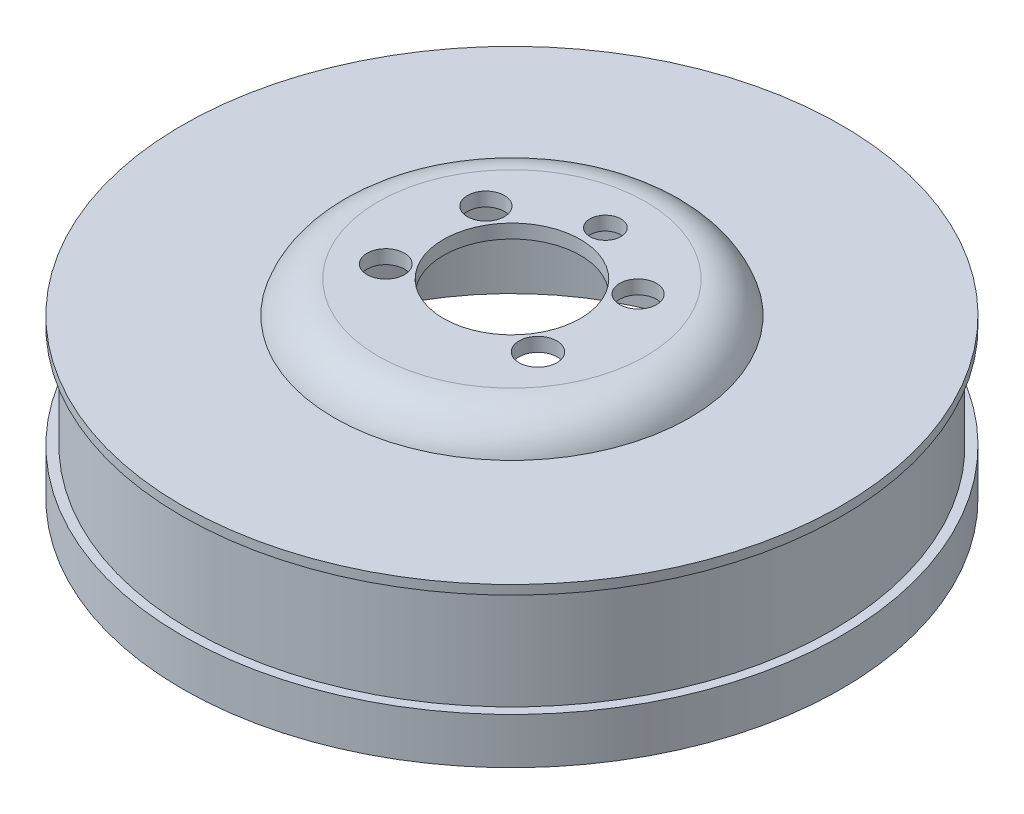
ISO-10303-21;
HEADER;
FILE_DESCRIPTION(('STEP AP214'),'2;1');
FILE_NAME('part.step','',(''),(''),'','','');
FILE_SCHEMA(('AUTOMOTIVE_DESIGN { 1 0 10303 214 1 1 1 1 }'));
ENDSEC;
DATA;
#1=APPLICATION_CONTEXT('core data for automotive mechanical design processes');
#2=APPLICATION_PROTOCOL_DEFINITION('international standard','automotive_design',2000,#1);
#3=PRODUCT_CONTEXT('',#1,'mechanical');
#4=PRODUCT('Part','Part','',(#3));
#5=PRODUCT_RELATED_PRODUCT_CATEGORY('part','',(#4));
#6=PRODUCT_DEFINITION_FORMATION('','',#4);
#7=PRODUCT_DEFINITION_CONTEXT('part definition',#1,'design');
#8=PRODUCT_DEFINITION('design','',#6,#7);
#9=PRODUCT_DEFINITION_SHAPE('','',#8);
#10=(LENGTH_UNIT() NAMED_UNIT(*) SI_UNIT(.MILLI.,.METRE.));
#11=(NAMED_UNIT(*) PLANE_ANGLE_UNIT() SI_UNIT($,.RADIAN.));
#12=(NAMED_UNIT(*) SI_UNIT($,.STERADIAN.) SOLID_ANGLE_UNIT());
#13=UNCERTAINTY_MEASURE_WITH_UNIT(LENGTH_MEASURE(1.E-05),#10,'distance_accuracy_value','');
#14=(GEOMETRIC_REPRESENTATION_CONTEXT(3) GLOBAL_UNCERTAINTY_ASSIGNED_CONTEXT((#13)) GLOBAL_UNIT_ASSIGNED_CONTEXT((#10,
#11,#12)) REPRESENTATION_CONTEXT('',''));
#15=CARTESIAN_POINT('',(0.,0.,0.));
#16=DIRECTION('',(0.,0.,1.));
#17=DIRECTION('',(1.,0.,0.));
#18=AXIS2_PLACEMENT_3D('',#15,#16,#17);
#19=CARTESIAN_POINT('',(0.,41.25,0.));
#20=DIRECTION('',(0.,1.,0.));
#21=DIRECTION('',(0.,0.,1.));
#22=AXIS2_PLACEMENT_3D('',#19,#20,#21);
#23=CYLINDRICAL_SURFACE('',#22,54.45);
#24=CARTESIAN_POINT('',(0.,30.4,0.));
#25=DIRECTION('',(0.,1.,0.));
#26=DIRECTION('',(0.,0.,1.));
#27=AXIS2_PLACEMENT_3D('',#24,#25,#26);
#28=CIRCLE('',#27,54.45);
#29=CARTESIAN_POINT('',(0.,30.4,54.45));
#30=VERTEX_POINT('',#29);
#31=EDGE_CURVE('E40',#30,#30,#28,.T.);
#32=ORIENTED_EDGE('',*,*,#31,.T.);
#33=EDGE_LOOP('',(#32));
#34=FACE_BOUND('',#33,.T.);
#35=CARTESIAN_POINT('',(0.,0.,0.));
#36=DIRECTION('',(0.,1.,0.));
#37=DIRECTION('',(0.,0.,1.));
#38=AXIS2_PLACEMENT_3D('',#35,#36,#37);
#39=CIRCLE('',#38,54.45);
#40=CARTESIAN_POINT('',(0.,0.,54.45));
#41=VERTEX_POINT('',#40);
#42=EDGE_CURVE('E74',#41,#41,#39,.T.);
#43=ORIENTED_EDGE('',*,*,#42,.F.);
#44=EDGE_LOOP('',(#43));
#45=FACE_BOUND('',#44,.T.);
#46=ADVANCED_FACE('F33',(#34,#45),#23,.F.);
#47=CARTESIAN_POINT('',(54.45,0.,0.));
#48=DIRECTION('',(0.,1.,0.));
#49=DIRECTION('',(0.,0.,1.));
#50=AXIS2_PLACEMENT_3D('',#47,#48,#49);
#51=PLANE('',#50);
#52=CARTESIAN_POINT('',(0.,0.,0.));
#53=DIRECTION('',(0.,1.,0.));
#54=DIRECTION('',(0.,0.,1.));
#55=AXIS2_PLACEMENT_3D('',#52,#53,#54);
#56=CIRCLE('',#55,71.45);
#57=CARTESIAN_POINT('',(0.,0.,71.45));
#58=VERTEX_POINT('',#57);
#59=EDGE_CURVE('E77',#58,#58,#56,.T.);
#60=ORIENTED_EDGE('',*,*,#59,.F.);
#61=EDGE_LOOP('',(#60));
#62=FACE_BOUND('',#61,.T.);
#63=ORIENTED_EDGE('',*,*,#42,.T.);
#64=EDGE_LOOP('',(#63));
#65=FACE_BOUND('',#64,.T.);
#66=ADVANCED_FACE('F154',(#62,#65),#51,.F.);
#67=CARTESIAN_POINT('',(0.,41.25,0.));
#68=DIRECTION('',(0.,1.,0.));
#69=DIRECTION('',(0.,0.,1.));
#70=AXIS2_PLACEMENT_3D('',#67,#68,#69);
#71=CYLINDRICAL_SURFACE('',#70,71.45);
#72=CARTESIAN_POINT('',(0.,10.,0.));
#73=DIRECTION('',(0.,1.,0.));
#74=DIRECTION('',(0.,0.,1.));
#75=AXIS2_PLACEMENT_3D('',#72,#73,#74);
#76=CIRCLE('',#75,71.45);
#77=CARTESIAN_POINT('',(0.,10.,71.45));
#78=VERTEX_POINT('',#77);
#79=EDGE_CURVE('E80',#78,#78,#76,.T.);
#80=ORIENTED_EDGE('',*,*,#79,.F.);
#81=EDGE_LOOP('',(#80));
#82=FACE_BOUND('',#81,.T.);
#83=ORIENTED_EDGE('',*,*,#59,.T.);
#84=EDGE_LOOP('',(#83));
#85=FACE_BOUND('',#84,.T.);
#86=ADVANCED_FACE('F158',(#82,#85),#71,.T.);
#87=CARTESIAN_POINT('',(71.45,10.,0.));
#88=DIRECTION('',(0.,-1.,0.));
#89=DIRECTION('',(0.,0.,-1.));
#90=AXIS2_PLACEMENT_3D('',#87,#88,#89);
#91=PLANE('',#90);
#92=CARTESIAN_POINT('',(0.,10.,0.));
#93=DIRECTION('',(0.,1.,0.));
#94=DIRECTION('',(0.,0.,1.));
#95=AXIS2_PLACEMENT_3D('',#92,#93,#94);
#96=CIRCLE('',#95,69.45);
#97=CARTESIAN_POINT('',(0.,10.,69.45));
#98=VERTEX_POINT('',#97);
#99=EDGE_CURVE('E83',#98,#98,#96,.T.);
#100=ORIENTED_EDGE('',*,*,#99,.F.);
#101=EDGE_LOOP('',(#100));
#102=FACE_BOUND('',#101,.T.);
#103=ORIENTED_EDGE('',*,*,#79,.T.);
#104=EDGE_LOOP('',(#103));
#105=FACE_BOUND('',#104,.T.);
#106=ADVANCED_FACE('F165',(#102,#105),#91,.F.);
#107=CARTESIAN_POINT('',(0.,41.25,0.));
#108=DIRECTION('',(0.,1.,0.));
#109=DIRECTION('',(0.,0.,1.));
#110=AXIS2_PLACEMENT_3D('',#107,#108,#109);
#111=CYLINDRICAL_SURFACE('',#110,69.45);
#112=CARTESIAN_POINT('',(0.,32.4,0.));
#113=DIRECTION('',(0.,1.,0.));
#114=DIRECTION('',(0.,0.,1.));
#115=AXIS2_PLACEMENT_3D('',#112,#113,#114);
#116=CIRCLE('',#115,69.45);
#117=CARTESIAN_POINT('',(0.,32.4,69.45));
#118=VERTEX_POINT('',#117);
#119=EDGE_CURVE('E86',#118,#118,#116,.T.);
#120=ORIENTED_EDGE('',*,*,#119,.F.);
#121=EDGE_LOOP('',(#120));
#122=FACE_BOUND('',#121,.T.);
#123=ORIENTED_EDGE('',*,*,#99,.T.);
#124=EDGE_LOOP('',(#123));
#125=FACE_BOUND('',#124,.T.);
#126=ADVANCED_FACE('F169',(#122,#125),#111,.T.);
#127=CARTESIAN_POINT('',(69.45,32.4,0.));
#128=DIRECTION('',(0.,1.,0.));
#129=DIRECTION('',(0.,0.,1.));
#130=AXIS2_PLACEMENT_3D('',#127,#128,#129);
#131=PLANE('',#130);
#132=CARTESIAN_POINT('',(0.,32.4,0.));
#133=DIRECTION('',(0.,1.,0.));
#134=DIRECTION('',(0.,0.,1.));
#135=AXIS2_PLACEMENT_3D('',#132,#133,#134);
#136=CIRCLE('',#135,71.45);
#137=CARTESIAN_POINT('',(0.,32.4,71.45));
#138=VERTEX_POINT('',#137);
#139=EDGE_CURVE('E89',#138,#138,#136,.T.);
#140=ORIENTED_EDGE('',*,*,#139,.F.);
#141=EDGE_LOOP('',(#140));
#142=FACE_BOUND('',#141,.T.);
#143=ORIENTED_EDGE('',*,*,#119,.T.);
#144=EDGE_LOOP('',(#143));
#145=FACE_BOUND('',#144,.T.);
#146=ADVANCED_FACE('F173',(#142,#145),#131,.F.);
#147=CARTESIAN_POINT('',(0.,41.25,0.));
#148=DIRECTION('',(0.,1.,0.));
#149=DIRECTION('',(0.,0.,1.));
#150=AXIS2_PLACEMENT_3D('',#147,#148,#149);
#151=CYLINDRICAL_SURFACE('',#150,71.45);
#152=CARTESIAN_POINT('',(0.,34.4,0.));
#153=DIRECTION('',(0.,1.,0.));
#154=DIRECTION('',(0.,0.,1.));
#155=AXIS2_PLACEMENT_3D('',#152,#153,#154);
#156=CIRCLE('',#155,71.45);
#157=CARTESIAN_POINT('',(0.,34.4,71.45));
#158=VERTEX_POINT('',#157);
#159=EDGE_CURVE('E92',#158,#158,#156,.T.);
#160=ORIENTED_EDGE('',*,*,#159,.F.);
#161=EDGE_LOOP('',(#160));
#162=FACE_BOUND('',#161,.T.);
#163=ORIENTED_EDGE('',*,*,#139,.T.);
#164=EDGE_LOOP('',(#163));
#165=FACE_BOUND('',#164,.T.);
#166=ADVANCED_FACE('F177',(#162,#165),#151,.T.);
#167=CARTESIAN_POINT('',(71.45,34.4,0.));
#168=DIRECTION('',(0.,-1.,0.));
#169=DIRECTION('',(0.,0.,-1.));
#170=AXIS2_PLACEMENT_3D('',#167,#168,#169);
#171=PLANE('',#170);
#172=CARTESIAN_POINT('',(0.,34.4,0.));
#173=DIRECTION('',(0.,1.,0.));
#174=DIRECTION('',(0.,0.,1.));
#175=AXIS2_PLACEMENT_3D('',#172,#173,#174);
#176=CIRCLE('',#175,38.5);
#177=CARTESIAN_POINT('',(0.,34.4,38.5));
#178=VERTEX_POINT('',#177);
#179=EDGE_CURVE('E95',#178,#178,#176,.T.);
#180=ORIENTED_EDGE('',*,*,#179,.F.);
#181=EDGE_LOOP('',(#180));
#182=FACE_BOUND('',#181,.T.);
#183=ORIENTED_EDGE('',*,*,#159,.T.);
#184=EDGE_LOOP('',(#183));
#185=FACE_BOUND('',#184,.T.);
#186=ADVANCED_FACE('F124',(#182,#185),#171,.F.);
#187=CARTESIAN_POINT('',(0.,41.25,0.));
#188=DIRECTION('',(0.,-1.,0.));
#189=DIRECTION('',(0.,0.,-1.));
#190=AXIS2_PLACEMENT_3D('',#187,#188,#189);
#191=PLANE('',#190);
#192=CARTESIAN_POINT('',(0.518366505601803,41.25,-19.743196199346));
#193=DIRECTION('',(0.,1.,0.));
#194=DIRECTION('',(0.,0.,1.));
#195=AXIS2_PLACEMENT_3D('',#192,#193,#194);
#196=CIRCLE('',#195,3.35);
#197=CARTESIAN_POINT('',(0.518366505601803,41.25,-16.393196199346));
#198=VERTEX_POINT('',#197);
#199=EDGE_CURVE('E67',#198,#198,#196,.T.);
#200=ORIENTED_EDGE('',*,*,#199,.F.);
#201=EDGE_LOOP('',(#200));
#202=FACE_BOUND('',#201,.T.);
#203=CARTESIAN_POINT('',(-16.5,41.25,-10.8541466730462));
#204=DIRECTION('',(0.,1.,0.));
#205=DIRECTION('',(0.,0.,1.));
#206=AXIS2_PLACEMENT_3D('',#203,#204,#205);
#207=CIRCLE('',#206,4.);
#208=CARTESIAN_POINT('',(-16.5,41.25,-6.8541466730462));
#209=VERTEX_POINT('',#208);
#210=EDGE_CURVE('E111',#209,#209,#207,.T.);
#211=ORIENTED_EDGE('',*,*,#210,.F.);
#212=EDGE_LOOP('',(#211));
#213=FACE_BOUND('',#212,.T.);
#214=CARTESIAN_POINT('',(16.5,41.25,-10.8541466730462));
#215=DIRECTION('',(0.,1.,0.));
#216=DIRECTION('',(0.,0.,1.));
#217=AXIS2_PLACEMENT_3D('',#214,#215,#216);
#218=CIRCLE('',#217,4.);
#219=CARTESIAN_POINT('',(16.5,41.25,-6.8541466730462));
#220=VERTEX_POINT('',#219);
#221=EDGE_CURVE('E108',#220,#220,#218,.T.);
#222=ORIENTED_EDGE('',*,*,#221,.F.);
#223=EDGE_LOOP('',(#222));
#224=FACE_BOUND('',#223,.T.);
#225=CARTESIAN_POINT('',(16.5,41.25,10.8541466730462));
#226=DIRECTION('',(0.,1.,0.));
#227=DIRECTION('',(0.,0.,1.));
#228=AXIS2_PLACEMENT_3D('',#225,#226,#227);
#229=CIRCLE('',#228,4.1);
#230=CARTESIAN_POINT('',(16.5,41.25,14.9541466730462));
#231=VERTEX_POINT('',#230);
#232=EDGE_CURVE('E105',#231,#231,#229,.T.);
#233=ORIENTED_EDGE('',*,*,#232,.F.);
#234=EDGE_LOOP('',(#233));
#235=FACE_BOUND('',#234,.T.);
#236=CARTESIAN_POINT('',(-16.5,41.25,10.8541466730462));
#237=DIRECTION('',(0.,1.,0.));
#238=DIRECTION('',(0.,0.,1.));
#239=AXIS2_PLACEMENT_3D('',#236,#237,#238);
#240=CIRCLE('',#239,4.05);
#241=CARTESIAN_POINT('',(-16.5,41.25,14.9041466730462));
#242=VERTEX_POINT('',#241);
#243=EDGE_CURVE('E102',#242,#242,#240,.T.);
#244=ORIENTED_EDGE('',*,*,#243,.F.);
#245=EDGE_LOOP('',(#244));
#246=FACE_BOUND('',#245,.T.);
#247=CARTESIAN_POINT('',(0.,41.25,0.));
#248=DIRECTION('',(0.,1.,0.));
#249=DIRECTION('',(0.,0.,1.));
#250=AXIS2_PLACEMENT_3D('',#247,#248,#249);
#251=CIRCLE('',#250,14.85);
#252=CARTESIAN_POINT('',(0.,41.25,14.85));
#253=VERTEX_POINT('',#252);
#254=EDGE_CURVE('E54',#253,#253,#251,.T.);
#255=ORIENTED_EDGE('',*,*,#254,.F.);
#256=EDGE_LOOP('',(#255));
#257=FACE_BOUND('',#256,.T.);
#258=CARTESIAN_POINT('',(0.,41.25,0.));
#259=DIRECTION('',(0.,-1.,0.));
#260=DIRECTION('',(0.,0.,-1.));
#261=AXIS2_PLACEMENT_3D('',#258,#259,#260);
#262=CIRCLE('',#261,29.0090832897976);
#263=CARTESIAN_POINT('',(0.,41.25,-29.0090832897976));
#264=VERTEX_POINT('',#263);
#265=EDGE_CURVE('E48',#264,#264,#262,.F.);
#266=ORIENTED_EDGE('',*,*,#265,.T.);
#267=EDGE_LOOP('',(#266));
#268=FACE_BOUND('',#267,.T.);
#269=ADVANCED_FACE('F120',(#202,#213,#224,#235,#246,#257,#268),#191,.F.);
#270=CARTESIAN_POINT('',(0.,38.25,0.));
#271=DIRECTION('',(0.,1.,0.));
#272=DIRECTION('',(0.,0.,1.));
#273=AXIS2_PLACEMENT_3D('',#270,#271,#272);
#274=PLANE('',#273);
#275=CARTESIAN_POINT('',(0.518366505601803,38.25,-19.743196199346));
#276=DIRECTION('',(0.,1.,0.));
#277=DIRECTION('',(0.,0.,1.));
#278=AXIS2_PLACEMENT_3D('',#275,#276,#277);
#279=CIRCLE('',#278,3.35);
#280=CARTESIAN_POINT('',(0.518366505601803,38.25,-16.393196199346));
#281=VERTEX_POINT('',#280);
#282=EDGE_CURVE('E51',#281,#281,#279,.T.);
#283=ORIENTED_EDGE('',*,*,#282,.T.);
#284=EDGE_LOOP('',(#283));
#285=FACE_BOUND('',#284,.T.);
#286=CARTESIAN_POINT('',(-16.5,38.25,-10.8541466730462));
#287=DIRECTION('',(0.,1.,0.));
#288=DIRECTION('',(0.,0.,1.));
#289=AXIS2_PLACEMENT_3D('',#286,#287,#288);
#290=CIRCLE('',#289,4.);
#291=CARTESIAN_POINT('',(-16.5,38.25,-6.8541466730462));
#292=VERTEX_POINT('',#291);
#293=EDGE_CURVE('E55',#292,#292,#290,.T.);
#294=ORIENTED_EDGE('',*,*,#293,.T.);
#295=EDGE_LOOP('',(#294));
#296=FACE_BOUND('',#295,.T.);
#297=CARTESIAN_POINT('',(16.5,38.25,-10.8541466730462));
#298=DIRECTION('',(0.,1.,0.));
#299=DIRECTION('',(0.,0.,1.));
#300=AXIS2_PLACEMENT_3D('',#297,#298,#299);
#301=CIRCLE('',#300,4.);
#302=CARTESIAN_POINT('',(16.5,38.25,-6.8541466730462));
#303=VERTEX_POINT('',#302);
#304=EDGE_CURVE('E58',#303,#303,#301,.T.);
#305=ORIENTED_EDGE('',*,*,#304,.T.);
#306=EDGE_LOOP('',(#305));
#307=FACE_BOUND('',#306,.T.);
#308=CARTESIAN_POINT('',(16.5,38.25,10.8541466730462));
#309=DIRECTION('',(0.,1.,0.));
#310=DIRECTION('',(0.,0.,1.));
#311=AXIS2_PLACEMENT_3D('',#308,#309,#310);
#312=CIRCLE('',#311,4.1);
#313=CARTESIAN_POINT('',(16.5,38.25,14.9541466730462));
#314=VERTEX_POINT('',#313);
#315=EDGE_CURVE('E61',#314,#314,#312,.T.);
#316=ORIENTED_EDGE('',*,*,#315,.T.);
#317=EDGE_LOOP('',(#316));
#318=FACE_BOUND('',#317,.T.);
#319=CARTESIAN_POINT('',(-16.5,38.25,10.8541466730462));
#320=DIRECTION('',(0.,1.,0.));
#321=DIRECTION('',(0.,0.,1.));
#322=AXIS2_PLACEMENT_3D('',#319,#320,#321);
#323=CIRCLE('',#322,4.05);
#324=CARTESIAN_POINT('',(-16.5,38.25,14.9041466730462));
#325=VERTEX_POINT('',#324);
#326=EDGE_CURVE('E64',#325,#325,#323,.T.);
#327=ORIENTED_EDGE('',*,*,#326,.T.);
#328=EDGE_LOOP('',(#327));
#329=FACE_BOUND('',#328,.T.);
#330=CARTESIAN_POINT('',(0.,38.25,0.));
#331=DIRECTION('',(0.,1.,0.));
#332=DIRECTION('',(0.,0.,1.));
#333=AXIS2_PLACEMENT_3D('',#330,#331,#332);
#334=CIRCLE('',#333,14.85);
#335=CARTESIAN_POINT('',(0.,38.25,14.85));
#336=VERTEX_POINT('',#335);
#337=EDGE_CURVE('E68',#336,#336,#334,.T.);
#338=ORIENTED_EDGE('',*,*,#337,.T.);
#339=EDGE_LOOP('',(#338));
#340=FACE_BOUND('',#339,.T.);
#341=CARTESIAN_POINT('',(0.,38.25,0.));
#342=DIRECTION('',(0.,1.,0.));
#343=DIRECTION('',(0.,0.,1.));
#344=AXIS2_PLACEMENT_3D('',#341,#342,#343);
#345=CIRCLE('',#344,35.5);
#346=CARTESIAN_POINT('',(0.,38.25,35.5));
#347=VERTEX_POINT('',#346);
#348=EDGE_CURVE('E71',#347,#347,#345,.T.);
#349=ORIENTED_EDGE('',*,*,#348,.F.);
#350=EDGE_LOOP('',(#349));
#351=FACE_BOUND('',#350,.T.);
#352=ADVANCED_FACE('F123',(#285,#296,#307,#318,#329,#340,#351),#274,.F.);
#353=CARTESIAN_POINT('',(35.5,31.4,0.));
#354=DIRECTION('',(0.,1.,0.));
#355=DIRECTION('',(0.,0.,1.));
#356=AXIS2_PLACEMENT_3D('',#353,#354,#355);
#357=PLANE('',#356);
#358=CARTESIAN_POINT('',(0.,31.4,0.));
#359=DIRECTION('',(0.,1.,0.));
#360=DIRECTION('',(0.,0.,1.));
#361=AXIS2_PLACEMENT_3D('',#358,#359,#360);
#362=CIRCLE('',#361,53.45);
#363=CARTESIAN_POINT('',(0.,31.4,53.45));
#364=VERTEX_POINT('',#363);
#365=EDGE_CURVE('E10',#364,#364,#362,.F.);
#366=ORIENTED_EDGE('',*,*,#365,.T.);
#367=EDGE_LOOP('',(#366));
#368=FACE_BOUND('',#367,.T.);
#369=CARTESIAN_POINT('',(0.,31.4,0.));
#370=DIRECTION('',(0.,1.,0.));
#371=DIRECTION('',(0.,0.,1.));
#372=AXIS2_PLACEMENT_3D('',#369,#370,#371);
#373=CIRCLE('',#372,44.9909167102024);
#374=CARTESIAN_POINT('',(0.,31.4,44.9909167102024));
#375=VERTEX_POINT('',#374);
#376=EDGE_CURVE('E44',#375,#375,#373,.T.);
#377=ORIENTED_EDGE('',*,*,#376,.T.);
#378=EDGE_LOOP('',(#377));
#379=FACE_BOUND('',#378,.T.);
#380=ADVANCED_FACE('F141',(#368,#379),#357,.F.);
#381=CARTESIAN_POINT('',(0.,31.25,0.));
#382=DIRECTION('',(0.,1.,0.));
#383=DIRECTION('',(0.,0.,1.));
#384=AXIS2_PLACEMENT_3D('',#381,#382,#383);
#385=TOROIDAL_SURFACE('',#384,29.0090832897976,10.);
#386=ORIENTED_EDGE('',*,*,#179,.T.);
#387=EDGE_LOOP('',(#386));
#388=FACE_BOUND('',#387,.T.);
#389=ORIENTED_EDGE('',*,*,#265,.F.);
#390=EDGE_LOOP('',(#389));
#391=FACE_BOUND('',#390,.T.);
#392=ADVANCED_FACE('F138',(#388,#391),#385,.T.);
#393=CARTESIAN_POINT('',(0.,31.25,0.));
#394=DIRECTION('',(0.,1.,0.));
#395=DIRECTION('',(0.,0.,1.));
#396=AXIS2_PLACEMENT_3D('',#393,#394,#395);
#397=CYLINDRICAL_SURFACE('',#396,14.85);
#398=ORIENTED_EDGE('',*,*,#254,.T.);
#399=EDGE_LOOP('',(#398));
#400=FACE_BOUND('',#399,.T.);
#401=ORIENTED_EDGE('',*,*,#337,.F.);
#402=EDGE_LOOP('',(#401));
#403=FACE_BOUND('',#402,.T.);
#404=ADVANCED_FACE('F140',(#400,#403),#397,.F.);
#405=CARTESIAN_POINT('',(-16.5,31.25,10.8541466730462));
#406=DIRECTION('',(0.,1.,0.));
#407=DIRECTION('',(0.,0.,1.));
#408=AXIS2_PLACEMENT_3D('',#405,#406,#407);
#409=CYLINDRICAL_SURFACE('',#408,4.05);
#410=ORIENTED_EDGE('',*,*,#243,.T.);
#411=EDGE_LOOP('',(#410));
#412=FACE_BOUND('',#411,.T.);
#413=ORIENTED_EDGE('',*,*,#326,.F.);
#414=EDGE_LOOP('',(#413));
#415=FACE_BOUND('',#414,.T.);
#416=ADVANCED_FACE('F148',(#412,#415),#409,.F.);
#417=CARTESIAN_POINT('',(16.5,31.25,10.8541466730462));
#418=DIRECTION('',(0.,1.,0.));
#419=DIRECTION('',(0.,0.,1.));
#420=AXIS2_PLACEMENT_3D('',#417,#418,#419);
#421=CYLINDRICAL_SURFACE('',#420,4.1);
#422=ORIENTED_EDGE('',*,*,#232,.T.);
#423=EDGE_LOOP('',(#422));
#424=FACE_BOUND('',#423,.T.);
#425=ORIENTED_EDGE('',*,*,#315,.F.);
#426=EDGE_LOOP('',(#425));
#427=FACE_BOUND('',#426,.T.);
#428=ADVANCED_FACE('F190',(#424,#427),#421,.F.);
#429=CARTESIAN_POINT('',(16.5,31.25,-10.8541466730462));
#430=DIRECTION('',(0.,1.,0.));
#431=DIRECTION('',(0.,0.,1.));
#432=AXIS2_PLACEMENT_3D('',#429,#430,#431);
#433=CYLINDRICAL_SURFACE('',#432,4.);
#434=ORIENTED_EDGE('',*,*,#221,.T.);
#435=EDGE_LOOP('',(#434));
#436=FACE_BOUND('',#435,.T.);
#437=ORIENTED_EDGE('',*,*,#304,.F.);
#438=EDGE_LOOP('',(#437));
#439=FACE_BOUND('',#438,.T.);
#440=ADVANCED_FACE('F194',(#436,#439),#433,.F.);
#441=CARTESIAN_POINT('',(-16.5,31.25,-10.8541466730462));
#442=DIRECTION('',(0.,1.,0.));
#443=DIRECTION('',(0.,0.,1.));
#444=AXIS2_PLACEMENT_3D('',#441,#442,#443);
#445=CYLINDRICAL_SURFACE('',#444,4.);
#446=ORIENTED_EDGE('',*,*,#210,.T.);
#447=EDGE_LOOP('',(#446));
#448=FACE_BOUND('',#447,.T.);
#449=ORIENTED_EDGE('',*,*,#293,.F.);
#450=EDGE_LOOP('',(#449));
#451=FACE_BOUND('',#450,.T.);
#452=ADVANCED_FACE('F198',(#448,#451),#445,.F.);
#453=CARTESIAN_POINT('',(0.518366505601803,31.25,-19.743196199346));
#454=DIRECTION('',(0.,1.,0.));
#455=DIRECTION('',(0.,0.,1.));
#456=AXIS2_PLACEMENT_3D('',#453,#454,#455);
#457=CYLINDRICAL_SURFACE('',#456,3.35);
#458=ORIENTED_EDGE('',*,*,#199,.T.);
#459=EDGE_LOOP('',(#458));
#460=FACE_BOUND('',#459,.T.);
#461=ORIENTED_EDGE('',*,*,#282,.F.);
#462=EDGE_LOOP('',(#461));
#463=FACE_BOUND('',#462,.T.);
#464=ADVANCED_FACE('F117',(#460,#463),#457,.F.);
#465=CARTESIAN_POINT('',(0.,41.4,0.));
#466=DIRECTION('',(0.,1.,0.));
#467=DIRECTION('',(0.,0.,1.));
#468=AXIS2_PLACEMENT_3D('',#465,#466,#467);
#469=TOROIDAL_SURFACE('',#468,44.9909167102024,10.);
#470=ORIENTED_EDGE('',*,*,#348,.T.);
#471=EDGE_LOOP('',(#470));
#472=FACE_BOUND('',#471,.T.);
#473=ORIENTED_EDGE('',*,*,#376,.F.);
#474=EDGE_LOOP('',(#473));
#475=FACE_BOUND('',#474,.T.);
#476=ADVANCED_FACE('F204',(#472,#475),#469,.T.);
#477=CARTESIAN_POINT('',(0.,30.4,0.));
#478=DIRECTION('',(0.,1.,0.));
#479=DIRECTION('',(0.,0.,1.));
#480=AXIS2_PLACEMENT_3D('',#477,#478,#479);
#481=TOROIDAL_SURFACE('',#480,53.45,1.);
#482=ORIENTED_EDGE('',*,*,#365,.F.);
#483=EDGE_LOOP('',(#482));
#484=FACE_BOUND('',#483,.T.);
#485=ORIENTED_EDGE('',*,*,#31,.F.);
#486=EDGE_LOOP('',(#485));
#487=FACE_BOUND('',#486,.T.);
#488=ADVANCED_FACE('F35',(#484,#487),#481,.F.);
#489=CLOSED_SHELL('',(#46,#66,#86,#106,#126,#146,#166,#186,#269,#352,#380,#392,#404,#416,#428,
#440,#452,#464,#476,#488));
#490=MANIFOLD_SOLID_BREP('B2',#489);
#491=ADVANCED_BREP_SHAPE_REPRESENTATION('',(#18,#490),#14);
#492=SHAPE_DEFINITION_REPRESENTATION(#9,#491);
ENDSEC;
END-ISO-10303-21;
